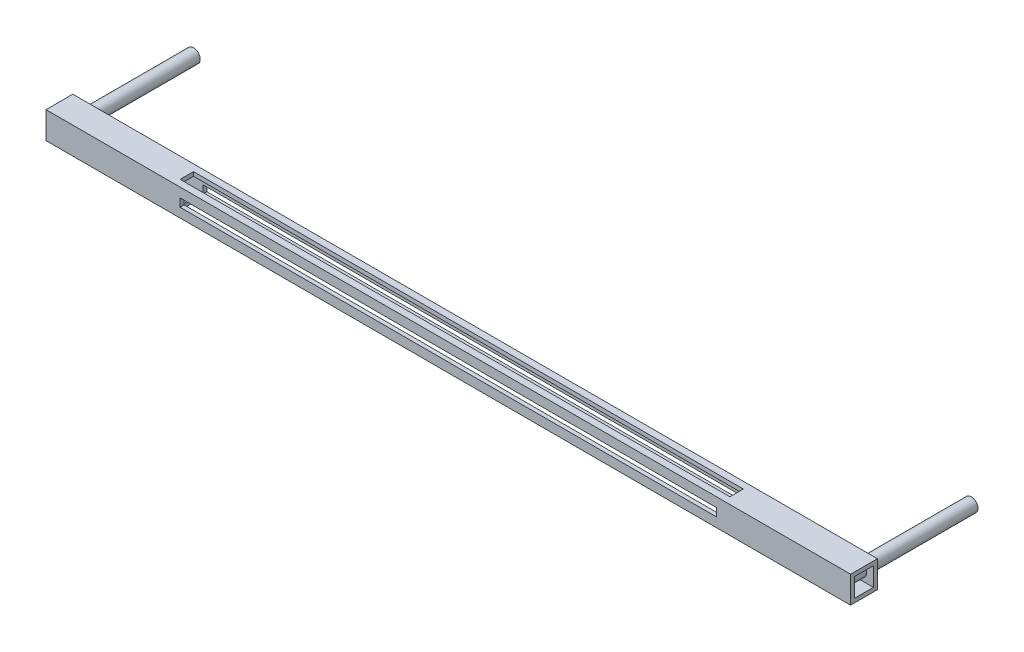
ISO-10303-21;
HEADER;
FILE_DESCRIPTION(('STEP AP214'),'2;1');
FILE_NAME('part.step','',(''),(''),'','','');
FILE_SCHEMA(('AUTOMOTIVE_DESIGN { 1 0 10303 214 1 1 1 1 }'));
ENDSEC;
DATA;
#1=APPLICATION_CONTEXT('core data for automotive mechanical design processes');
#2=APPLICATION_PROTOCOL_DEFINITION('international standard','automotive_design',2000,#1);
#3=PRODUCT_CONTEXT('',#1,'mechanical');
#4=PRODUCT('Part','Part','',(#3));
#5=PRODUCT_RELATED_PRODUCT_CATEGORY('part','',(#4));
#6=PRODUCT_DEFINITION_FORMATION('','',#4);
#7=PRODUCT_DEFINITION_CONTEXT('part definition',#1,'design');
#8=PRODUCT_DEFINITION('design','',#6,#7);
#9=PRODUCT_DEFINITION_SHAPE('','',#8);
#10=(LENGTH_UNIT() NAMED_UNIT(*) SI_UNIT(.MILLI.,.METRE.));
#11=(NAMED_UNIT(*) PLANE_ANGLE_UNIT() SI_UNIT($,.RADIAN.));
#12=(NAMED_UNIT(*) SI_UNIT($,.STERADIAN.) SOLID_ANGLE_UNIT());
#13=UNCERTAINTY_MEASURE_WITH_UNIT(LENGTH_MEASURE(1.E-05),#10,'distance_accuracy_value','');
#14=(GEOMETRIC_REPRESENTATION_CONTEXT(3) GLOBAL_UNCERTAINTY_ASSIGNED_CONTEXT((#13)) GLOBAL_UNIT_ASSIGNED_CONTEXT((#10,
#11,#12)) REPRESENTATION_CONTEXT('',''));
#15=CARTESIAN_POINT('',(0.,0.,0.));
#16=DIRECTION('',(0.,0.,1.));
#17=DIRECTION('',(1.,0.,0.));
#18=AXIS2_PLACEMENT_3D('',#15,#16,#17);
#19=CARTESIAN_POINT('',(300.,0.,0.));
#20=DIRECTION('',(-1.,0.,0.));
#21=DIRECTION('',(0.,0.,1.));
#22=AXIS2_PLACEMENT_3D('',#19,#20,#21);
#23=PLANE('',#22);
#24=DIRECTION('',(0.,0.,1.));
#25=VECTOR('',#24,1.);
#26=CARTESIAN_POINT('',(300.,5.,5.));
#27=LINE('',#26,#25);
#28=CARTESIAN_POINT('',(300.,5.,-5.));
#29=VERTEX_POINT('',#28);
#30=CARTESIAN_POINT('',(300.,5.,5.));
#31=VERTEX_POINT('',#30);
#32=EDGE_CURVE('E351',#29,#31,#27,.T.);
#33=ORIENTED_EDGE('',*,*,#32,.T.);
#34=DIRECTION('',(0.,-1.,0.));
#35=VECTOR('',#34,1.);
#36=CARTESIAN_POINT('',(300.,5.,5.));
#37=LINE('',#36,#35);
#38=CARTESIAN_POINT('',(300.,-5.,5.));
#39=VERTEX_POINT('',#38);
#40=EDGE_CURVE('E354',#31,#39,#37,.T.);
#41=ORIENTED_EDGE('',*,*,#40,.T.);
#42=DIRECTION('',(0.,0.,-1.));
#43=VECTOR('',#42,1.);
#44=CARTESIAN_POINT('',(300.,-5.,5.));
#45=LINE('',#44,#43);
#46=CARTESIAN_POINT('',(300.,-5.,-5.));
#47=VERTEX_POINT('',#46);
#48=EDGE_CURVE('E357',#39,#47,#45,.T.);
#49=ORIENTED_EDGE('',*,*,#48,.T.);
#50=DIRECTION('',(0.,1.,0.));
#51=VECTOR('',#50,1.);
#52=CARTESIAN_POINT('',(300.,5.,-5.));
#53=LINE('',#52,#51);
#54=EDGE_CURVE('E359',#47,#29,#53,.T.);
#55=ORIENTED_EDGE('',*,*,#54,.T.);
#56=EDGE_LOOP('',(#33,#41,#49,#55));
#57=FACE_BOUND('',#56,.T.);
#58=DIRECTION('',(0.,0.,1.));
#59=VECTOR('',#58,1.);
#60=CARTESIAN_POINT('',(300.,3.5,3.5));
#61=LINE('',#60,#59);
#62=CARTESIAN_POINT('',(300.,3.5,-3.5));
#63=VERTEX_POINT('',#62);
#64=CARTESIAN_POINT('',(300.,3.5,3.5));
#65=VERTEX_POINT('',#64);
#66=EDGE_CURVE('E320',#63,#65,#61,.T.);
#67=ORIENTED_EDGE('',*,*,#66,.F.);
#68=DIRECTION('',(0.,1.,0.));
#69=VECTOR('',#68,1.);
#70=CARTESIAN_POINT('',(300.,3.5,-3.5));
#71=LINE('',#70,#69);
#72=CARTESIAN_POINT('',(300.,-3.5,-3.5));
#73=VERTEX_POINT('',#72);
#74=EDGE_CURVE('E328',#73,#63,#71,.T.);
#75=ORIENTED_EDGE('',*,*,#74,.F.);
#76=DIRECTION('',(0.,0.,-1.));
#77=VECTOR('',#76,1.);
#78=CARTESIAN_POINT('',(300.,-3.5,3.5));
#79=LINE('',#78,#77);
#80=CARTESIAN_POINT('',(300.,-3.5,3.5));
#81=VERTEX_POINT('',#80);
#82=EDGE_CURVE('E325',#81,#73,#79,.T.);
#83=ORIENTED_EDGE('',*,*,#82,.F.);
#84=DIRECTION('',(0.,-1.,0.));
#85=VECTOR('',#84,1.);
#86=CARTESIAN_POINT('',(300.,3.5,3.5));
#87=LINE('',#86,#85);
#88=EDGE_CURVE('E322',#65,#81,#87,.T.);
#89=ORIENTED_EDGE('',*,*,#88,.F.);
#90=EDGE_LOOP('',(#67,#75,#83,#89));
#91=FACE_BOUND('',#90,.T.);
#92=ADVANCED_FACE('F39',(#57,#91),#23,.F.);
#93=CARTESIAN_POINT('',(0.,0.,0.));
#94=DIRECTION('',(-1.,0.,0.));
#95=DIRECTION('',(0.,0.,1.));
#96=AXIS2_PLACEMENT_3D('',#93,#94,#95);
#97=PLANE('',#96);
#98=DIRECTION('',(0.,0.,1.));
#99=VECTOR('',#98,1.);
#100=CARTESIAN_POINT('',(0.,5.,5.));
#101=LINE('',#100,#99);
#102=CARTESIAN_POINT('',(0.,5.,-5.));
#103=VERTEX_POINT('',#102);
#104=CARTESIAN_POINT('',(0.,5.,5.));
#105=VERTEX_POINT('',#104);
#106=EDGE_CURVE('E350',#103,#105,#101,.T.);
#107=ORIENTED_EDGE('',*,*,#106,.F.);
#108=DIRECTION('',(0.,1.,0.));
#109=VECTOR('',#108,1.);
#110=CARTESIAN_POINT('',(0.,5.,-5.));
#111=LINE('',#110,#109);
#112=CARTESIAN_POINT('',(0.,-5.,-5.));
#113=VERTEX_POINT('',#112);
#114=EDGE_CURVE('E355',#113,#103,#111,.T.);
#115=ORIENTED_EDGE('',*,*,#114,.F.);
#116=DIRECTION('',(0.,0.,-1.));
#117=VECTOR('',#116,1.);
#118=CARTESIAN_POINT('',(0.,-5.,5.));
#119=LINE('',#118,#117);
#120=CARTESIAN_POINT('',(0.,-5.,5.));
#121=VERTEX_POINT('',#120);
#122=EDGE_CURVE('E366',#121,#113,#119,.T.);
#123=ORIENTED_EDGE('',*,*,#122,.F.);
#124=DIRECTION('',(0.,-1.,0.));
#125=VECTOR('',#124,1.);
#126=CARTESIAN_POINT('',(0.,5.,5.));
#127=LINE('',#126,#125);
#128=EDGE_CURVE('E364',#105,#121,#127,.T.);
#129=ORIENTED_EDGE('',*,*,#128,.F.);
#130=EDGE_LOOP('',(#107,#115,#123,#129));
#131=FACE_BOUND('',#130,.T.);
#132=DIRECTION('',(0.,1.,0.));
#133=VECTOR('',#132,1.);
#134=CARTESIAN_POINT('',(0.,3.5,-3.5));
#135=LINE('',#134,#133);
#136=CARTESIAN_POINT('',(0.,-3.5,-3.5));
#137=VERTEX_POINT('',#136);
#138=CARTESIAN_POINT('',(0.,3.5,-3.5));
#139=VERTEX_POINT('',#138);
#140=EDGE_CURVE('E323',#137,#139,#135,.T.);
#141=ORIENTED_EDGE('',*,*,#140,.T.);
#142=DIRECTION('',(0.,0.,1.));
#143=VECTOR('',#142,1.);
#144=CARTESIAN_POINT('',(0.,3.5,3.5));
#145=LINE('',#144,#143);
#146=CARTESIAN_POINT('',(0.,3.5,3.5));
#147=VERTEX_POINT('',#146);
#148=EDGE_CURVE('E319',#139,#147,#145,.T.);
#149=ORIENTED_EDGE('',*,*,#148,.T.);
#150=DIRECTION('',(0.,-1.,0.));
#151=VECTOR('',#150,1.);
#152=CARTESIAN_POINT('',(0.,3.5,3.5));
#153=LINE('',#152,#151);
#154=CARTESIAN_POINT('',(0.,-3.5,3.5));
#155=VERTEX_POINT('',#154);
#156=EDGE_CURVE('E333',#147,#155,#153,.T.);
#157=ORIENTED_EDGE('',*,*,#156,.T.);
#158=DIRECTION('',(0.,0.,-1.));
#159=VECTOR('',#158,1.);
#160=CARTESIAN_POINT('',(0.,-3.5,3.5));
#161=LINE('',#160,#159);
#162=EDGE_CURVE('E336',#155,#137,#161,.T.);
#163=ORIENTED_EDGE('',*,*,#162,.T.);
#164=EDGE_LOOP('',(#141,#149,#157,#163));
#165=FACE_BOUND('',#164,.T.);
#166=ADVANCED_FACE('F436',(#131,#165),#97,.T.);
#167=CARTESIAN_POINT('',(300.,5.,5.));
#168=DIRECTION('',(0.,-1.,0.));
#169=DIRECTION('',(0.,0.,-1.));
#170=AXIS2_PLACEMENT_3D('',#167,#168,#169);
#171=PLANE('',#170);
#172=DIRECTION('',(-1.,0.,0.));
#173=VECTOR('',#172,1.);
#174=CARTESIAN_POINT('',(252.5,5.,-2.5));
#175=LINE('',#174,#173);
#176=CARTESIAN_POINT('',(252.5,5.,-2.5));
#177=VERTEX_POINT('',#176);
#178=CARTESIAN_POINT('',(47.5000000000001,5.,-2.5));
#179=VERTEX_POINT('',#178);
#180=EDGE_CURVE('E276',#177,#179,#175,.T.);
#181=ORIENTED_EDGE('',*,*,#180,.F.);
#182=DIRECTION('',(0.,0.,-1.));
#183=VECTOR('',#182,1.);
#184=CARTESIAN_POINT('',(252.5,5.,2.5));
#185=LINE('',#184,#183);
#186=CARTESIAN_POINT('',(252.5,5.,2.5));
#187=VERTEX_POINT('',#186);
#188=EDGE_CURVE('E274',#187,#177,#185,.T.);
#189=ORIENTED_EDGE('',*,*,#188,.F.);
#190=DIRECTION('',(1.,0.,0.));
#191=VECTOR('',#190,1.);
#192=CARTESIAN_POINT('',(252.5,5.,2.5));
#193=LINE('',#192,#191);
#194=CARTESIAN_POINT('',(47.5000000000001,5.,2.5));
#195=VERTEX_POINT('',#194);
#196=EDGE_CURVE('E282',#195,#187,#193,.T.);
#197=ORIENTED_EDGE('',*,*,#196,.F.);
#198=DIRECTION('',(0.,0.,1.));
#199=VECTOR('',#198,1.);
#200=CARTESIAN_POINT('',(47.5000000000001,5.,2.5));
#201=LINE('',#200,#199);
#202=EDGE_CURVE('E279',#179,#195,#201,.T.);
#203=ORIENTED_EDGE('',*,*,#202,.F.);
#204=EDGE_LOOP('',(#181,#189,#197,#203));
#205=FACE_BOUND('',#204,.T.);
#206=ORIENTED_EDGE('',*,*,#106,.T.);
#207=DIRECTION('',(-1.,0.,0.));
#208=VECTOR('',#207,1.);
#209=CARTESIAN_POINT('',(300.,5.,5.));
#210=LINE('',#209,#208);
#211=EDGE_CURVE('E377',#31,#105,#210,.T.);
#212=ORIENTED_EDGE('',*,*,#211,.F.);
#213=ORIENTED_EDGE('',*,*,#32,.F.);
#214=DIRECTION('',(-1.,0.,0.));
#215=VECTOR('',#214,1.);
#216=CARTESIAN_POINT('',(300.,5.,-5.));
#217=LINE('',#216,#215);
#218=EDGE_CURVE('E361',#29,#103,#217,.T.);
#219=ORIENTED_EDGE('',*,*,#218,.T.);
#220=EDGE_LOOP('',(#206,#212,#213,#219));
#221=FACE_BOUND('',#220,.T.);
#222=ADVANCED_FACE('F41',(#205,#221),#171,.F.);
#223=CARTESIAN_POINT('',(300.,5.,5.));
#224=DIRECTION('',(0.,0.,-1.));
#225=DIRECTION('',(-1.,0.,0.));
#226=AXIS2_PLACEMENT_3D('',#223,#224,#225);
#227=PLANE('',#226);
#228=DIRECTION('',(1.,0.,0.));
#229=VECTOR('',#228,1.);
#230=CARTESIAN_POINT('',(50.,-1.5,5.));
#231=LINE('',#230,#229);
#232=CARTESIAN_POINT('',(50.,-1.5,5.));
#233=VERTEX_POINT('',#232);
#234=CARTESIAN_POINT('',(250.,-1.5,5.));
#235=VERTEX_POINT('',#234);
#236=EDGE_CURVE('E215',#233,#235,#231,.T.);
#237=ORIENTED_EDGE('',*,*,#236,.F.);
#238=DIRECTION('',(0.,-1.,0.));
#239=VECTOR('',#238,1.);
#240=CARTESIAN_POINT('',(50.,1.5,5.));
#241=LINE('',#240,#239);
#242=CARTESIAN_POINT('',(50.,1.5,5.));
#243=VERTEX_POINT('',#242);
#244=EDGE_CURVE('E54',#243,#233,#241,.T.);
#245=ORIENTED_EDGE('',*,*,#244,.F.);
#246=DIRECTION('',(-1.,0.,0.));
#247=VECTOR('',#246,1.);
#248=CARTESIAN_POINT('',(50.,1.5,5.));
#249=LINE('',#248,#247);
#250=CARTESIAN_POINT('',(250.,1.5,5.));
#251=VERTEX_POINT('',#250);
#252=EDGE_CURVE('E223',#251,#243,#249,.T.);
#253=ORIENTED_EDGE('',*,*,#252,.F.);
#254=DIRECTION('',(0.,1.,0.));
#255=VECTOR('',#254,1.);
#256=CARTESIAN_POINT('',(250.,1.5,5.));
#257=LINE('',#256,#255);
#258=EDGE_CURVE('E206',#235,#251,#257,.T.);
#259=ORIENTED_EDGE('',*,*,#258,.F.);
#260=EDGE_LOOP('',(#237,#245,#253,#259));
#261=FACE_BOUND('',#260,.T.);
#262=ORIENTED_EDGE('',*,*,#128,.T.);
#263=DIRECTION('',(-1.,0.,0.));
#264=VECTOR('',#263,1.);
#265=CARTESIAN_POINT('',(300.,-5.,5.));
#266=LINE('',#265,#264);
#267=EDGE_CURVE('E374',#39,#121,#266,.T.);
#268=ORIENTED_EDGE('',*,*,#267,.F.);
#269=ORIENTED_EDGE('',*,*,#40,.F.);
#270=ORIENTED_EDGE('',*,*,#211,.T.);
#271=EDGE_LOOP('',(#262,#268,#269,#270));
#272=FACE_BOUND('',#271,.T.);
#273=ADVANCED_FACE('F220',(#261,#272),#227,.F.);
#274=CARTESIAN_POINT('',(300.,-5.,5.));
#275=DIRECTION('',(0.,1.,0.));
#276=DIRECTION('',(0.,0.,1.));
#277=AXIS2_PLACEMENT_3D('',#274,#275,#276);
#278=PLANE('',#277);
#279=DIRECTION('',(1.,0.,0.));
#280=VECTOR('',#279,1.);
#281=CARTESIAN_POINT('',(300.,-5.,2.5));
#282=LINE('',#281,#280);
#283=CARTESIAN_POINT('',(47.5000000000001,-5.,2.5));
#284=VERTEX_POINT('',#283);
#285=CARTESIAN_POINT('',(252.5,-5.,2.5));
#286=VERTEX_POINT('',#285);
#287=EDGE_CURVE('E311',#284,#286,#282,.T.);
#288=ORIENTED_EDGE('',*,*,#287,.T.);
#289=DIRECTION('',(0.,0.,-1.));
#290=VECTOR('',#289,1.);
#291=CARTESIAN_POINT('',(252.5,-5.,5.));
#292=LINE('',#291,#290);
#293=CARTESIAN_POINT('',(252.5,-5.,-2.5));
#294=VERTEX_POINT('',#293);
#295=EDGE_CURVE('E316',#286,#294,#292,.T.);
#296=ORIENTED_EDGE('',*,*,#295,.T.);
#297=DIRECTION('',(-1.,0.,0.));
#298=VECTOR('',#297,1.);
#299=CARTESIAN_POINT('',(300.,-5.,-2.5));
#300=LINE('',#299,#298);
#301=CARTESIAN_POINT('',(47.5,-5.,-2.5));
#302=VERTEX_POINT('',#301);
#303=EDGE_CURVE('E300',#294,#302,#300,.T.);
#304=ORIENTED_EDGE('',*,*,#303,.T.);
#305=DIRECTION('',(0.,0.,1.));
#306=VECTOR('',#305,1.);
#307=CARTESIAN_POINT('',(47.5000000000001,-5.,5.));
#308=LINE('',#307,#306);
#309=EDGE_CURVE('E306',#302,#284,#308,.T.);
#310=ORIENTED_EDGE('',*,*,#309,.T.);
#311=EDGE_LOOP('',(#288,#296,#304,#310));
#312=FACE_BOUND('',#311,.T.);
#313=ORIENTED_EDGE('',*,*,#122,.T.);
#314=DIRECTION('',(-1.,0.,0.));
#315=VECTOR('',#314,1.);
#316=CARTESIAN_POINT('',(300.,-5.,-5.));
#317=LINE('',#316,#315);
#318=EDGE_CURVE('E371',#47,#113,#317,.T.);
#319=ORIENTED_EDGE('',*,*,#318,.F.);
#320=ORIENTED_EDGE('',*,*,#48,.F.);
#321=ORIENTED_EDGE('',*,*,#267,.T.);
#322=EDGE_LOOP('',(#313,#319,#320,#321));
#323=FACE_BOUND('',#322,.T.);
#324=ADVANCED_FACE('F420',(#312,#323),#278,.F.);
#325=CARTESIAN_POINT('',(300.,5.,-5.));
#326=DIRECTION('',(0.,0.,1.));
#327=DIRECTION('',(1.,0.,0.));
#328=AXIS2_PLACEMENT_3D('',#325,#326,#327);
#329=PLANE('',#328);
#330=DIRECTION('',(-1.,0.,0.));
#331=VECTOR('',#330,1.);
#332=CARTESIAN_POINT('',(300.,1.5,-5.));
#333=LINE('',#332,#331);
#334=CARTESIAN_POINT('',(250.,1.5,-5.));
#335=VERTEX_POINT('',#334);
#336=CARTESIAN_POINT('',(50.,1.5,-5.));
#337=VERTEX_POINT('',#336);
#338=EDGE_CURVE('E246',#335,#337,#333,.T.);
#339=ORIENTED_EDGE('',*,*,#338,.T.);
#340=DIRECTION('',(0.,-1.,0.));
#341=VECTOR('',#340,1.);
#342=CARTESIAN_POINT('',(50.,5.,-5.));
#343=LINE('',#342,#341);
#344=CARTESIAN_POINT('',(50.,-1.5,-5.));
#345=VERTEX_POINT('',#344);
#346=EDGE_CURVE('E251',#337,#345,#343,.T.);
#347=ORIENTED_EDGE('',*,*,#346,.T.);
#348=DIRECTION('',(1.,0.,0.));
#349=VECTOR('',#348,1.);
#350=CARTESIAN_POINT('',(300.,-1.5,-5.));
#351=LINE('',#350,#349);
#352=CARTESIAN_POINT('',(250.,-1.5,-5.));
#353=VERTEX_POINT('',#352);
#354=EDGE_CURVE('E237',#345,#353,#351,.T.);
#355=ORIENTED_EDGE('',*,*,#354,.T.);
#356=DIRECTION('',(0.,1.,0.));
#357=VECTOR('',#356,1.);
#358=CARTESIAN_POINT('',(250.,5.,-5.));
#359=LINE('',#358,#357);
#360=EDGE_CURVE('E241',#353,#335,#359,.T.);
#361=ORIENTED_EDGE('',*,*,#360,.T.);
#362=EDGE_LOOP('',(#339,#347,#355,#361));
#363=FACE_BOUND('',#362,.T.);
#364=CARTESIAN_POINT('',(5.,0.,-5.));
#365=DIRECTION('',(0.,0.,1.));
#366=DIRECTION('',(1.,0.,0.));
#367=AXIS2_PLACEMENT_3D('',#364,#365,#366);
#368=CIRCLE('',#367,2.5);
#369=CARTESIAN_POINT('',(7.5,0.,-5.));
#370=VERTEX_POINT('',#369);
#371=EDGE_CURVE('E268',#370,#370,#368,.T.);
#372=ORIENTED_EDGE('',*,*,#371,.T.);
#373=EDGE_LOOP('',(#372));
#374=FACE_BOUND('',#373,.T.);
#375=CARTESIAN_POINT('',(295.,0.,-5.));
#376=DIRECTION('',(0.,0.,1.));
#377=DIRECTION('',(1.,0.,0.));
#378=AXIS2_PLACEMENT_3D('',#375,#376,#377);
#379=CIRCLE('',#378,2.50000000000002);
#380=CARTESIAN_POINT('',(297.5,0.,-5.));
#381=VERTEX_POINT('',#380);
#382=EDGE_CURVE('E258',#381,#381,#379,.T.);
#383=ORIENTED_EDGE('',*,*,#382,.T.);
#384=EDGE_LOOP('',(#383));
#385=FACE_BOUND('',#384,.T.);
#386=ORIENTED_EDGE('',*,*,#114,.T.);
#387=ORIENTED_EDGE('',*,*,#218,.F.);
#388=ORIENTED_EDGE('',*,*,#54,.F.);
#389=ORIENTED_EDGE('',*,*,#318,.T.);
#390=EDGE_LOOP('',(#386,#387,#388,#389));
#391=FACE_BOUND('',#390,.T.);
#392=ADVANCED_FACE('F416',(#363,#374,#385,#391),#329,.F.);
#393=CARTESIAN_POINT('',(300.,3.5,3.5));
#394=DIRECTION('',(0.,-1.,0.));
#395=DIRECTION('',(0.,0.,-1.));
#396=AXIS2_PLACEMENT_3D('',#393,#394,#395);
#397=PLANE('',#396);
#398=DIRECTION('',(0.,0.,1.));
#399=VECTOR('',#398,1.);
#400=CARTESIAN_POINT('',(252.5,3.5,3.5));
#401=LINE('',#400,#399);
#402=CARTESIAN_POINT('',(252.5,3.49999999999995,-2.5));
#403=VERTEX_POINT('',#402);
#404=CARTESIAN_POINT('',(252.5,3.49999999999995,2.5));
#405=VERTEX_POINT('',#404);
#406=EDGE_CURVE('E314',#403,#405,#401,.T.);
#407=ORIENTED_EDGE('',*,*,#406,.F.);
#408=DIRECTION('',(1.,0.,0.));
#409=VECTOR('',#408,1.);
#410=CARTESIAN_POINT('',(300.,3.5,-2.5));
#411=LINE('',#410,#409);
#412=CARTESIAN_POINT('',(47.5,3.5,-2.5));
#413=VERTEX_POINT('',#412);
#414=EDGE_CURVE('E298',#413,#403,#411,.T.);
#415=ORIENTED_EDGE('',*,*,#414,.F.);
#416=DIRECTION('',(0.,0.,-1.));
#417=VECTOR('',#416,1.);
#418=CARTESIAN_POINT('',(47.5000000000001,3.5,3.5));
#419=LINE('',#418,#417);
#420=CARTESIAN_POINT('',(47.5000000000001,3.49999999999995,2.5));
#421=VERTEX_POINT('',#420);
#422=EDGE_CURVE('E303',#421,#413,#419,.T.);
#423=ORIENTED_EDGE('',*,*,#422,.F.);
#424=DIRECTION('',(-1.,0.,0.));
#425=VECTOR('',#424,1.);
#426=CARTESIAN_POINT('',(300.,3.5,2.5));
#427=LINE('',#426,#425);
#428=EDGE_CURVE('E309',#405,#421,#427,.T.);
#429=ORIENTED_EDGE('',*,*,#428,.F.);
#430=EDGE_LOOP('',(#407,#415,#423,#429));
#431=FACE_BOUND('',#430,.T.);
#432=ORIENTED_EDGE('',*,*,#148,.F.);
#433=DIRECTION('',(-1.,0.,0.));
#434=VECTOR('',#433,1.);
#435=CARTESIAN_POINT('',(300.,3.5,-3.5));
#436=LINE('',#435,#434);
#437=EDGE_CURVE('E330',#63,#139,#436,.T.);
#438=ORIENTED_EDGE('',*,*,#437,.F.);
#439=ORIENTED_EDGE('',*,*,#66,.T.);
#440=DIRECTION('',(-1.,0.,0.));
#441=VECTOR('',#440,1.);
#442=CARTESIAN_POINT('',(300.,3.5,3.5));
#443=LINE('',#442,#441);
#444=EDGE_CURVE('E347',#65,#147,#443,.T.);
#445=ORIENTED_EDGE('',*,*,#444,.T.);
#446=EDGE_LOOP('',(#432,#438,#439,#445));
#447=FACE_BOUND('',#446,.T.);
#448=ADVANCED_FACE('F419',(#431,#447),#397,.T.);
#449=CARTESIAN_POINT('',(300.,3.5,3.5));
#450=DIRECTION('',(0.,0.,-1.));
#451=DIRECTION('',(-1.,0.,0.));
#452=AXIS2_PLACEMENT_3D('',#449,#450,#451);
#453=PLANE('',#452);
#454=DIRECTION('',(0.,1.,0.));
#455=VECTOR('',#454,1.);
#456=CARTESIAN_POINT('',(50.,3.5,3.5));
#457=LINE('',#456,#455);
#458=CARTESIAN_POINT('',(50.,-1.5,3.5));
#459=VERTEX_POINT('',#458);
#460=CARTESIAN_POINT('',(50.,1.5,3.5));
#461=VERTEX_POINT('',#460);
#462=EDGE_CURVE('E249',#459,#461,#457,.T.);
#463=ORIENTED_EDGE('',*,*,#462,.F.);
#464=DIRECTION('',(-1.,0.,0.));
#465=VECTOR('',#464,1.);
#466=CARTESIAN_POINT('',(300.,-1.5,3.5));
#467=LINE('',#466,#465);
#468=CARTESIAN_POINT('',(250.,-1.5,3.5));
#469=VERTEX_POINT('',#468);
#470=EDGE_CURVE('E235',#469,#459,#467,.T.);
#471=ORIENTED_EDGE('',*,*,#470,.F.);
#472=DIRECTION('',(0.,-1.,0.));
#473=VECTOR('',#472,1.);
#474=CARTESIAN_POINT('',(250.,3.5,3.5));
#475=LINE('',#474,#473);
#476=CARTESIAN_POINT('',(250.,1.5,3.5));
#477=VERTEX_POINT('',#476);
#478=EDGE_CURVE('E209',#477,#469,#475,.T.);
#479=ORIENTED_EDGE('',*,*,#478,.F.);
#480=DIRECTION('',(1.,0.,0.));
#481=VECTOR('',#480,1.);
#482=CARTESIAN_POINT('',(300.,1.5,3.5));
#483=LINE('',#482,#481);
#484=EDGE_CURVE('E244',#461,#477,#483,.T.);
#485=ORIENTED_EDGE('',*,*,#484,.F.);
#486=EDGE_LOOP('',(#463,#471,#479,#485));
#487=FACE_BOUND('',#486,.T.);
#488=CARTESIAN_POINT('',(5.,0.,3.5));
#489=DIRECTION('',(0.,0.,-1.));
#490=DIRECTION('',(-1.,0.,0.));
#491=AXIS2_PLACEMENT_3D('',#488,#489,#490);
#492=CIRCLE('',#491,2.5);
#493=CARTESIAN_POINT('',(2.5,0.,3.5));
#494=VERTEX_POINT('',#493);
#495=EDGE_CURVE('E264',#494,#494,#492,.T.);
#496=ORIENTED_EDGE('',*,*,#495,.F.);
#497=EDGE_LOOP('',(#496));
#498=FACE_BOUND('',#497,.T.);
#499=CARTESIAN_POINT('',(295.,0.,3.5));
#500=DIRECTION('',(0.,0.,-1.));
#501=DIRECTION('',(-1.,0.,0.));
#502=AXIS2_PLACEMENT_3D('',#499,#500,#501);
#503=CIRCLE('',#502,2.50000000000002);
#504=CARTESIAN_POINT('',(292.5,0.,3.5));
#505=VERTEX_POINT('',#504);
#506=EDGE_CURVE('E261',#505,#505,#503,.T.);
#507=ORIENTED_EDGE('',*,*,#506,.F.);
#508=EDGE_LOOP('',(#507));
#509=FACE_BOUND('',#508,.T.);
#510=ORIENTED_EDGE('',*,*,#156,.F.);
#511=ORIENTED_EDGE('',*,*,#444,.F.);
#512=ORIENTED_EDGE('',*,*,#88,.T.);
#513=DIRECTION('',(-1.,0.,0.));
#514=VECTOR('',#513,1.);
#515=CARTESIAN_POINT('',(300.,-3.5,3.5));
#516=LINE('',#515,#514);
#517=EDGE_CURVE('E345',#81,#155,#516,.T.);
#518=ORIENTED_EDGE('',*,*,#517,.T.);
#519=EDGE_LOOP('',(#510,#511,#512,#518));
#520=FACE_BOUND('',#519,.T.);
#521=ADVANCED_FACE('F459',(#487,#498,#509,#520),#453,.T.);
#522=CARTESIAN_POINT('',(300.,-3.5,3.5));
#523=DIRECTION('',(0.,1.,0.));
#524=DIRECTION('',(0.,0.,1.));
#525=AXIS2_PLACEMENT_3D('',#522,#523,#524);
#526=PLANE('',#525);
#527=DIRECTION('',(0.,0.,-1.));
#528=VECTOR('',#527,1.);
#529=CARTESIAN_POINT('',(252.5,-3.5,3.5));
#530=LINE('',#529,#528);
#531=CARTESIAN_POINT('',(252.5,-3.49999999999995,2.5));
#532=VERTEX_POINT('',#531);
#533=CARTESIAN_POINT('',(252.5,-3.5,-2.5));
#534=VERTEX_POINT('',#533);
#535=EDGE_CURVE('E386',#532,#534,#530,.T.);
#536=ORIENTED_EDGE('',*,*,#535,.F.);
#537=DIRECTION('',(1.,0.,0.));
#538=VECTOR('',#537,1.);
#539=CARTESIAN_POINT('',(300.,-3.5,2.5));
#540=LINE('',#539,#538);
#541=CARTESIAN_POINT('',(47.5000000000001,-3.49999999999995,2.5));
#542=VERTEX_POINT('',#541);
#543=EDGE_CURVE('E384',#542,#532,#540,.T.);
#544=ORIENTED_EDGE('',*,*,#543,.F.);
#545=DIRECTION('',(0.,0.,1.));
#546=VECTOR('',#545,1.);
#547=CARTESIAN_POINT('',(47.5000000000001,-3.5,3.5));
#548=LINE('',#547,#546);
#549=CARTESIAN_POINT('',(47.5000000000001,-3.49999999999995,-2.5));
#550=VERTEX_POINT('',#549);
#551=EDGE_CURVE('E382',#550,#542,#548,.T.);
#552=ORIENTED_EDGE('',*,*,#551,.F.);
#553=DIRECTION('',(-1.,0.,0.));
#554=VECTOR('',#553,1.);
#555=CARTESIAN_POINT('',(300.,-3.5,-2.5));
#556=LINE('',#555,#554);
#557=EDGE_CURVE('E380',#534,#550,#556,.T.);
#558=ORIENTED_EDGE('',*,*,#557,.F.);
#559=EDGE_LOOP('',(#536,#544,#552,#558));
#560=FACE_BOUND('',#559,.T.);
#561=ORIENTED_EDGE('',*,*,#162,.F.);
#562=ORIENTED_EDGE('',*,*,#517,.F.);
#563=ORIENTED_EDGE('',*,*,#82,.T.);
#564=DIRECTION('',(-1.,0.,0.));
#565=VECTOR('',#564,1.);
#566=CARTESIAN_POINT('',(300.,-3.5,-3.5));
#567=LINE('',#566,#565);
#568=EDGE_CURVE('E343',#73,#137,#567,.T.);
#569=ORIENTED_EDGE('',*,*,#568,.T.);
#570=EDGE_LOOP('',(#561,#562,#563,#569));
#571=FACE_BOUND('',#570,.T.);
#572=ADVANCED_FACE('F463',(#560,#571),#526,.T.);
#573=CARTESIAN_POINT('',(300.,3.5,-3.5));
#574=DIRECTION('',(0.,0.,1.));
#575=DIRECTION('',(1.,0.,0.));
#576=AXIS2_PLACEMENT_3D('',#573,#574,#575);
#577=PLANE('',#576);
#578=DIRECTION('',(0.,-1.,0.));
#579=VECTOR('',#578,1.);
#580=CARTESIAN_POINT('',(50.,3.5,-3.5));
#581=LINE('',#580,#579);
#582=CARTESIAN_POINT('',(50.,1.5,-3.5));
#583=VERTEX_POINT('',#582);
#584=CARTESIAN_POINT('',(50.,-1.5,-3.5));
#585=VERTEX_POINT('',#584);
#586=EDGE_CURVE('E11',#583,#585,#581,.T.);
#587=ORIENTED_EDGE('',*,*,#586,.F.);
#588=DIRECTION('',(-1.,0.,0.));
#589=VECTOR('',#588,1.);
#590=CARTESIAN_POINT('',(300.,1.5,-3.5));
#591=LINE('',#590,#589);
#592=CARTESIAN_POINT('',(250.,1.5,-3.5));
#593=VERTEX_POINT('',#592);
#594=EDGE_CURVE('E47',#593,#583,#591,.T.);
#595=ORIENTED_EDGE('',*,*,#594,.F.);
#596=DIRECTION('',(0.,1.,0.));
#597=VECTOR('',#596,1.);
#598=CARTESIAN_POINT('',(250.,3.5,-3.5));
#599=LINE('',#598,#597);
#600=CARTESIAN_POINT('',(250.,-1.5,-3.5));
#601=VERTEX_POINT('',#600);
#602=EDGE_CURVE('E395',#601,#593,#599,.T.);
#603=ORIENTED_EDGE('',*,*,#602,.F.);
#604=DIRECTION('',(1.,0.,0.));
#605=VECTOR('',#604,1.);
#606=CARTESIAN_POINT('',(300.,-1.5,-3.5));
#607=LINE('',#606,#605);
#608=EDGE_CURVE('E271',#585,#601,#607,.T.);
#609=ORIENTED_EDGE('',*,*,#608,.F.);
#610=EDGE_LOOP('',(#587,#595,#603,#609));
#611=FACE_BOUND('',#610,.T.);
#612=CARTESIAN_POINT('',(5.,0.,-3.5));
#613=DIRECTION('',(0.,0.,1.));
#614=DIRECTION('',(1.,0.,0.));
#615=AXIS2_PLACEMENT_3D('',#612,#613,#614);
#616=CIRCLE('',#615,2.5);
#617=CARTESIAN_POINT('',(7.5,0.,-3.5));
#618=VERTEX_POINT('',#617);
#619=EDGE_CURVE('E265',#618,#618,#616,.T.);
#620=ORIENTED_EDGE('',*,*,#619,.F.);
#621=EDGE_LOOP('',(#620));
#622=FACE_BOUND('',#621,.T.);
#623=CARTESIAN_POINT('',(295.,0.,-3.5));
#624=DIRECTION('',(0.,0.,1.));
#625=DIRECTION('',(1.,0.,0.));
#626=AXIS2_PLACEMENT_3D('',#623,#624,#625);
#627=CIRCLE('',#626,2.50000000000002);
#628=CARTESIAN_POINT('',(297.5,0.,-3.5));
#629=VERTEX_POINT('',#628);
#630=EDGE_CURVE('E389',#629,#629,#627,.T.);
#631=ORIENTED_EDGE('',*,*,#630,.F.);
#632=EDGE_LOOP('',(#631));
#633=FACE_BOUND('',#632,.T.);
#634=ORIENTED_EDGE('',*,*,#140,.F.);
#635=ORIENTED_EDGE('',*,*,#568,.F.);
#636=ORIENTED_EDGE('',*,*,#74,.T.);
#637=ORIENTED_EDGE('',*,*,#437,.T.);
#638=EDGE_LOOP('',(#634,#635,#636,#637));
#639=FACE_BOUND('',#638,.T.);
#640=ADVANCED_FACE('F410',(#611,#622,#633,#639),#577,.T.);
#641=CARTESIAN_POINT('',(252.5,-735.,-2.5));
#642=DIRECTION('',(0.,0.,-1.));
#643=DIRECTION('',(-1.,0.,0.));
#644=AXIS2_PLACEMENT_3D('',#641,#642,#643);
#645=PLANE('',#644);
#646=DIRECTION('',(0.,1.,0.));
#647=VECTOR('',#646,1.);
#648=CARTESIAN_POINT('',(252.5,-735.,-2.5));
#649=LINE('',#648,#647);
#650=EDGE_CURVE('E295',#294,#534,#649,.T.);
#651=ORIENTED_EDGE('',*,*,#650,.T.);
#652=ORIENTED_EDGE('',*,*,#557,.T.);
#653=DIRECTION('',(0.,1.,0.));
#654=VECTOR('',#653,1.);
#655=CARTESIAN_POINT('',(47.5000000000001,-735.,-2.5));
#656=LINE('',#655,#654);
#657=EDGE_CURVE('E292',#302,#550,#656,.T.);
#658=ORIENTED_EDGE('',*,*,#657,.F.);
#659=ORIENTED_EDGE('',*,*,#303,.F.);
#660=EDGE_LOOP('',(#651,#652,#658,#659));
#661=FACE_BOUND('',#660,.T.);
#662=ADVANCED_FACE('F470',(#661),#645,.F.);
#663=CARTESIAN_POINT('',(47.5000000000001,-735.,2.5));
#664=DIRECTION('',(-1.,0.,0.));
#665=DIRECTION('',(0.,0.,1.));
#666=AXIS2_PLACEMENT_3D('',#663,#664,#665);
#667=PLANE('',#666);
#668=ORIENTED_EDGE('',*,*,#657,.T.);
#669=ORIENTED_EDGE('',*,*,#551,.T.);
#670=DIRECTION('',(0.,1.,0.));
#671=VECTOR('',#670,1.);
#672=CARTESIAN_POINT('',(47.5000000000001,-735.,2.5));
#673=LINE('',#672,#671);
#674=EDGE_CURVE('E289',#284,#542,#673,.T.);
#675=ORIENTED_EDGE('',*,*,#674,.F.);
#676=ORIENTED_EDGE('',*,*,#309,.F.);
#677=EDGE_LOOP('',(#668,#669,#675,#676));
#678=FACE_BOUND('',#677,.T.);
#679=ADVANCED_FACE('F479',(#678),#667,.F.);
#680=CARTESIAN_POINT('',(252.5,-735.,2.5));
#681=DIRECTION('',(0.,0.,1.));
#682=DIRECTION('',(1.,0.,0.));
#683=AXIS2_PLACEMENT_3D('',#680,#681,#682);
#684=PLANE('',#683);
#685=ORIENTED_EDGE('',*,*,#674,.T.);
#686=ORIENTED_EDGE('',*,*,#543,.T.);
#687=DIRECTION('',(0.,1.,0.));
#688=VECTOR('',#687,1.);
#689=CARTESIAN_POINT('',(252.5,-735.,2.5));
#690=LINE('',#689,#688);
#691=EDGE_CURVE('E288',#286,#532,#690,.T.);
#692=ORIENTED_EDGE('',*,*,#691,.F.);
#693=ORIENTED_EDGE('',*,*,#287,.F.);
#694=EDGE_LOOP('',(#685,#686,#692,#693));
#695=FACE_BOUND('',#694,.T.);
#696=ADVANCED_FACE('F475',(#695),#684,.F.);
#697=CARTESIAN_POINT('',(252.5,-735.,2.5));
#698=DIRECTION('',(1.,0.,0.));
#699=DIRECTION('',(0.,0.,-1.));
#700=AXIS2_PLACEMENT_3D('',#697,#698,#699);
#701=PLANE('',#700);
#702=ORIENTED_EDGE('',*,*,#691,.T.);
#703=ORIENTED_EDGE('',*,*,#535,.T.);
#704=ORIENTED_EDGE('',*,*,#650,.F.);
#705=ORIENTED_EDGE('',*,*,#295,.F.);
#706=EDGE_LOOP('',(#702,#703,#704,#705));
#707=FACE_BOUND('',#706,.T.);
#708=ADVANCED_FACE('F471',(#707),#701,.F.);
#709=ORIENTED_EDGE('',*,*,#406,.T.);
#710=EDGE_CURVE('E286',#405,#187,#690,.T.);
#711=ORIENTED_EDGE('',*,*,#710,.T.);
#712=ORIENTED_EDGE('',*,*,#188,.T.);
#713=EDGE_CURVE('E285',#403,#177,#649,.T.);
#714=ORIENTED_EDGE('',*,*,#713,.F.);
#715=EDGE_LOOP('',(#709,#711,#712,#714));
#716=FACE_BOUND('',#715,.T.);
#717=ADVANCED_FACE('F474',(#716),#701,.F.);
#718=ORIENTED_EDGE('',*,*,#428,.T.);
#719=EDGE_CURVE('E290',#421,#195,#673,.T.);
#720=ORIENTED_EDGE('',*,*,#719,.T.);
#721=ORIENTED_EDGE('',*,*,#196,.T.);
#722=ORIENTED_EDGE('',*,*,#710,.F.);
#723=EDGE_LOOP('',(#718,#720,#721,#722));
#724=FACE_BOUND('',#723,.T.);
#725=ADVANCED_FACE('F489',(#724),#684,.F.);
#726=ORIENTED_EDGE('',*,*,#422,.T.);
#727=EDGE_CURVE('E293',#413,#179,#656,.T.);
#728=ORIENTED_EDGE('',*,*,#727,.T.);
#729=ORIENTED_EDGE('',*,*,#202,.T.);
#730=ORIENTED_EDGE('',*,*,#719,.F.);
#731=EDGE_LOOP('',(#726,#728,#729,#730));
#732=FACE_BOUND('',#731,.T.);
#733=ADVANCED_FACE('F485',(#732),#667,.F.);
#734=ORIENTED_EDGE('',*,*,#414,.T.);
#735=ORIENTED_EDGE('',*,*,#713,.T.);
#736=ORIENTED_EDGE('',*,*,#180,.T.);
#737=ORIENTED_EDGE('',*,*,#727,.F.);
#738=EDGE_LOOP('',(#734,#735,#736,#737));
#739=FACE_BOUND('',#738,.T.);
#740=ADVANCED_FACE('F481',(#739),#645,.F.);
#741=CARTESIAN_POINT('',(295.,0.,-45.));
#742=DIRECTION('',(0.,0.,1.));
#743=DIRECTION('',(1.,0.,0.));
#744=AXIS2_PLACEMENT_3D('',#741,#742,#743);
#745=CYLINDRICAL_SURFACE('',#744,2.50000000000002);
#746=ORIENTED_EDGE('',*,*,#506,.T.);
#747=EDGE_LOOP('',(#746));
#748=FACE_BOUND('',#747,.T.);
#749=ORIENTED_EDGE('',*,*,#630,.T.);
#750=EDGE_LOOP('',(#749));
#751=FACE_BOUND('',#750,.T.);
#752=ADVANCED_FACE('F496',(#748,#751),#745,.T.);
#753=CARTESIAN_POINT('',(5.,0.,-45.));
#754=DIRECTION('',(0.,0.,1.));
#755=DIRECTION('',(1.,0.,0.));
#756=AXIS2_PLACEMENT_3D('',#753,#754,#755);
#757=CYLINDRICAL_SURFACE('',#756,2.5);
#758=ORIENTED_EDGE('',*,*,#495,.T.);
#759=EDGE_LOOP('',(#758));
#760=FACE_BOUND('',#759,.T.);
#761=ORIENTED_EDGE('',*,*,#619,.T.);
#762=EDGE_LOOP('',(#761));
#763=FACE_BOUND('',#762,.T.);
#764=ADVANCED_FACE('F499',(#760,#763),#757,.T.);
#765=CARTESIAN_POINT('',(295.,0.,-45.));
#766=DIRECTION('',(0.,0.,1.));
#767=DIRECTION('',(-1.,0.,0.));
#768=AXIS2_PLACEMENT_3D('',#765,#766,#767);
#769=CIRCLE('',#768,2.50000000000002);
#770=CARTESIAN_POINT('',(292.5,0.,-45.));
#771=VERTEX_POINT('',#770);
#772=EDGE_CURVE('E254',#771,#771,#769,.T.);
#773=ORIENTED_EDGE('',*,*,#772,.T.);
#774=EDGE_LOOP('',(#773));
#775=FACE_BOUND('',#774,.T.);
#776=ORIENTED_EDGE('',*,*,#382,.F.);
#777=EDGE_LOOP('',(#776));
#778=FACE_BOUND('',#777,.T.);
#779=ADVANCED_FACE('F494',(#775,#778),#745,.T.);
#780=CARTESIAN_POINT('',(295.,0.,-45.));
#781=DIRECTION('',(0.,0.,-1.));
#782=DIRECTION('',(-1.,0.,0.));
#783=AXIS2_PLACEMENT_3D('',#780,#781,#782);
#784=PLANE('',#783);
#785=ORIENTED_EDGE('',*,*,#772,.F.);
#786=EDGE_LOOP('',(#785));
#787=FACE_BOUND('',#786,.T.);
#788=ADVANCED_FACE('F490',(#787),#784,.T.);
#789=CARTESIAN_POINT('',(5.,0.,-45.));
#790=DIRECTION('',(0.,0.,1.));
#791=DIRECTION('',(1.,0.,0.));
#792=AXIS2_PLACEMENT_3D('',#789,#790,#791);
#793=CIRCLE('',#792,2.5);
#794=CARTESIAN_POINT('',(7.5,0.,-45.));
#795=VERTEX_POINT('',#794);
#796=EDGE_CURVE('E255',#795,#795,#793,.T.);
#797=ORIENTED_EDGE('',*,*,#796,.T.);
#798=EDGE_LOOP('',(#797));
#799=FACE_BOUND('',#798,.T.);
#800=ORIENTED_EDGE('',*,*,#371,.F.);
#801=EDGE_LOOP('',(#800));
#802=FACE_BOUND('',#801,.T.);
#803=ADVANCED_FACE('F493',(#799,#802),#757,.T.);
#804=CARTESIAN_POINT('',(5.,0.,-45.));
#805=DIRECTION('',(0.,0.,1.));
#806=DIRECTION('',(1.,0.,0.));
#807=AXIS2_PLACEMENT_3D('',#804,#805,#806);
#808=PLANE('',#807);
#809=ORIENTED_EDGE('',*,*,#796,.F.);
#810=EDGE_LOOP('',(#809));
#811=FACE_BOUND('',#810,.T.);
#812=ADVANCED_FACE('F504',(#811),#808,.F.);
#813=CARTESIAN_POINT('',(50.,-1.5,-65.));
#814=DIRECTION('',(0.,-1.,0.));
#815=DIRECTION('',(0.,0.,-1.));
#816=AXIS2_PLACEMENT_3D('',#813,#814,#815);
#817=PLANE('',#816);
#818=DIRECTION('',(0.,0.,1.));
#819=VECTOR('',#818,1.);
#820=CARTESIAN_POINT('',(50.,-1.5,-65.));
#821=LINE('',#820,#819);
#822=EDGE_CURVE('E212',#345,#585,#821,.T.);
#823=ORIENTED_EDGE('',*,*,#822,.T.);
#824=ORIENTED_EDGE('',*,*,#608,.T.);
#825=DIRECTION('',(0.,0.,1.));
#826=VECTOR('',#825,1.);
#827=CARTESIAN_POINT('',(250.,-1.5,-65.));
#828=LINE('',#827,#826);
#829=EDGE_CURVE('E62',#353,#601,#828,.T.);
#830=ORIENTED_EDGE('',*,*,#829,.F.);
#831=ORIENTED_EDGE('',*,*,#354,.F.);
#832=EDGE_LOOP('',(#823,#824,#830,#831));
#833=FACE_BOUND('',#832,.T.);
#834=ADVANCED_FACE('F412',(#833),#817,.F.);
#835=CARTESIAN_POINT('',(250.,1.5,-65.));
#836=DIRECTION('',(1.,0.,0.));
#837=DIRECTION('',(0.,0.,-1.));
#838=AXIS2_PLACEMENT_3D('',#835,#836,#837);
#839=PLANE('',#838);
#840=ORIENTED_EDGE('',*,*,#829,.T.);
#841=ORIENTED_EDGE('',*,*,#602,.T.);
#842=DIRECTION('',(0.,0.,1.));
#843=VECTOR('',#842,1.);
#844=CARTESIAN_POINT('',(250.,1.5,-65.));
#845=LINE('',#844,#843);
#846=EDGE_CURVE('E231',#335,#593,#845,.T.);
#847=ORIENTED_EDGE('',*,*,#846,.F.);
#848=ORIENTED_EDGE('',*,*,#360,.F.);
#849=EDGE_LOOP('',(#840,#841,#847,#848));
#850=FACE_BOUND('',#849,.T.);
#851=ADVANCED_FACE('F414',(#850),#839,.F.);
#852=CARTESIAN_POINT('',(50.,1.5,-65.));
#853=DIRECTION('',(0.,1.,0.));
#854=DIRECTION('',(0.,0.,1.));
#855=AXIS2_PLACEMENT_3D('',#852,#853,#854);
#856=PLANE('',#855);
#857=ORIENTED_EDGE('',*,*,#846,.T.);
#858=ORIENTED_EDGE('',*,*,#594,.T.);
#859=DIRECTION('',(0.,0.,1.));
#860=VECTOR('',#859,1.);
#861=CARTESIAN_POINT('',(50.,1.5,-65.));
#862=LINE('',#861,#860);
#863=EDGE_CURVE('E230',#337,#583,#862,.T.);
#864=ORIENTED_EDGE('',*,*,#863,.F.);
#865=ORIENTED_EDGE('',*,*,#338,.F.);
#866=EDGE_LOOP('',(#857,#858,#864,#865));
#867=FACE_BOUND('',#866,.T.);
#868=ADVANCED_FACE('F401',(#867),#856,.F.);
#869=CARTESIAN_POINT('',(50.,1.5,-65.));
#870=DIRECTION('',(-1.,0.,0.));
#871=DIRECTION('',(0.,0.,1.));
#872=AXIS2_PLACEMENT_3D('',#869,#870,#871);
#873=PLANE('',#872);
#874=ORIENTED_EDGE('',*,*,#863,.T.);
#875=ORIENTED_EDGE('',*,*,#586,.T.);
#876=ORIENTED_EDGE('',*,*,#822,.F.);
#877=ORIENTED_EDGE('',*,*,#346,.F.);
#878=EDGE_LOOP('',(#874,#875,#876,#877));
#879=FACE_BOUND('',#878,.T.);
#880=ADVANCED_FACE('F407',(#879),#873,.F.);
#881=ORIENTED_EDGE('',*,*,#462,.T.);
#882=EDGE_CURVE('E228',#461,#243,#862,.T.);
#883=ORIENTED_EDGE('',*,*,#882,.T.);
#884=ORIENTED_EDGE('',*,*,#244,.T.);
#885=EDGE_CURVE('E217',#459,#233,#821,.T.);
#886=ORIENTED_EDGE('',*,*,#885,.F.);
#887=EDGE_LOOP('',(#881,#883,#884,#886));
#888=FACE_BOUND('',#887,.T.);
#889=ADVANCED_FACE('F510',(#888),#873,.F.);
#890=ORIENTED_EDGE('',*,*,#484,.T.);
#891=EDGE_CURVE('E232',#477,#251,#845,.T.);
#892=ORIENTED_EDGE('',*,*,#891,.T.);
#893=ORIENTED_EDGE('',*,*,#252,.T.);
#894=ORIENTED_EDGE('',*,*,#882,.F.);
#895=EDGE_LOOP('',(#890,#892,#893,#894));
#896=FACE_BOUND('',#895,.T.);
#897=ADVANCED_FACE('F516',(#896),#856,.F.);
#898=ORIENTED_EDGE('',*,*,#478,.T.);
#899=EDGE_CURVE('E201',#469,#235,#828,.T.);
#900=ORIENTED_EDGE('',*,*,#899,.T.);
#901=ORIENTED_EDGE('',*,*,#258,.T.);
#902=ORIENTED_EDGE('',*,*,#891,.F.);
#903=EDGE_LOOP('',(#898,#900,#901,#902));
#904=FACE_BOUND('',#903,.T.);
#905=ADVANCED_FACE('F203',(#904),#839,.F.);
#906=ORIENTED_EDGE('',*,*,#470,.T.);
#907=ORIENTED_EDGE('',*,*,#885,.T.);
#908=ORIENTED_EDGE('',*,*,#236,.T.);
#909=ORIENTED_EDGE('',*,*,#899,.F.);
#910=EDGE_LOOP('',(#906,#907,#908,#909));
#911=FACE_BOUND('',#910,.T.);
#912=ADVANCED_FACE('F216',(#911),#817,.F.);
#913=CLOSED_SHELL('',(#92,#166,#222,#273,#324,#392,#448,#521,#572,#640,#662,#679,#696,#708,#717,
#725,#733,#740,#752,#764,#779,#788,#803,#812,#834,#851,#868,#880,#889,#897,#905,#912));
#914=MANIFOLD_SOLID_BREP('B2',#913);
#915=ADVANCED_BREP_SHAPE_REPRESENTATION('',(#18,#914),#14);
#916=SHAPE_DEFINITION_REPRESENTATION(#9,#915);
ENDSEC;
END-ISO-10303-21;
